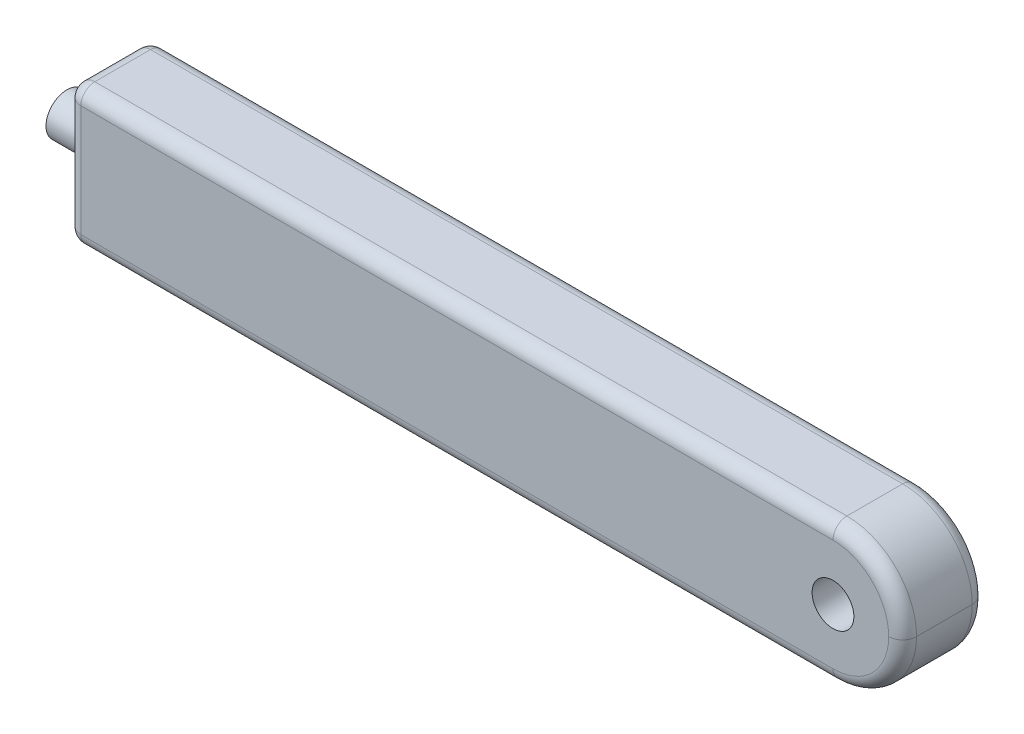
ISO-10303-21;
HEADER;
FILE_DESCRIPTION(('STEP AP214'),'2;1');
FILE_NAME('part.step','',(''),(''),'','','');
FILE_SCHEMA(('AUTOMOTIVE_DESIGN { 1 0 10303 214 1 1 1 1 }'));
ENDSEC;
DATA;
#1=APPLICATION_CONTEXT('core data for automotive mechanical design processes');
#2=APPLICATION_PROTOCOL_DEFINITION('international standard','automotive_design',2000,#1);
#3=PRODUCT_CONTEXT('',#1,'mechanical');
#4=PRODUCT('Part','Part','',(#3));
#5=PRODUCT_RELATED_PRODUCT_CATEGORY('part','',(#4));
#6=PRODUCT_DEFINITION_FORMATION('','',#4);
#7=PRODUCT_DEFINITION_CONTEXT('part definition',#1,'design');
#8=PRODUCT_DEFINITION('design','',#6,#7);
#9=PRODUCT_DEFINITION_SHAPE('','',#8);
#10=(LENGTH_UNIT() NAMED_UNIT(*) SI_UNIT(.MILLI.,.METRE.));
#11=(NAMED_UNIT(*) PLANE_ANGLE_UNIT() SI_UNIT($,.RADIAN.));
#12=(NAMED_UNIT(*) SI_UNIT($,.STERADIAN.) SOLID_ANGLE_UNIT());
#13=UNCERTAINTY_MEASURE_WITH_UNIT(LENGTH_MEASURE(1.E-05),#10,'distance_accuracy_value','');
#14=(GEOMETRIC_REPRESENTATION_CONTEXT(3) GLOBAL_UNCERTAINTY_ASSIGNED_CONTEXT((#13)) GLOBAL_UNIT_ASSIGNED_CONTEXT((#10,
#11,#12)) REPRESENTATION_CONTEXT('',''));
#15=CARTESIAN_POINT('',(0.,0.,0.));
#16=DIRECTION('',(0.,0.,1.));
#17=DIRECTION('',(1.,0.,0.));
#18=AXIS2_PLACEMENT_3D('',#15,#16,#17);
#19=CARTESIAN_POINT('',(0.,0.,30.));
#20=DIRECTION('',(0.,0.,-1.));
#21=DIRECTION('',(-1.,0.,0.));
#22=AXIS2_PLACEMENT_3D('',#19,#20,#21);
#23=PLANE('',#22);
#24=DIRECTION('',(0.,-1.,0.));
#25=VECTOR('',#24,1.);
#26=CARTESIAN_POINT('',(5.,0.,30.));
#27=LINE('',#26,#25);
#28=CARTESIAN_POINT('',(5.,45.,30.));
#29=VERTEX_POINT('',#28);
#30=CARTESIAN_POINT('',(5.,5.,30.));
#31=VERTEX_POINT('',#30);
#32=EDGE_CURVE('E226',#29,#31,#27,.T.);
#33=ORIENTED_EDGE('',*,*,#32,.T.);
#34=DIRECTION('',(1.,0.,0.));
#35=VECTOR('',#34,1.);
#36=CARTESIAN_POINT('',(0.,5.,30.));
#37=LINE('',#36,#35);
#38=CARTESIAN_POINT('',(275.,5.,30.));
#39=VERTEX_POINT('',#38);
#40=EDGE_CURVE('E157',#31,#39,#37,.T.);
#41=ORIENTED_EDGE('',*,*,#40,.T.);
#42=CARTESIAN_POINT('',(275.,25.,30.));
#43=DIRECTION('',(0.,0.,-1.));
#44=DIRECTION('',(-1.,0.,0.));
#45=AXIS2_PLACEMENT_3D('',#42,#43,#44);
#46=CIRCLE('',#45,20.);
#47=CARTESIAN_POINT('',(295.,25.,30.));
#48=VERTEX_POINT('',#47);
#49=EDGE_CURVE('E232',#39,#48,#46,.F.);
#50=ORIENTED_EDGE('',*,*,#49,.T.);
#51=CARTESIAN_POINT('',(275.,25.,30.));
#52=DIRECTION('',(0.,0.,-1.));
#53=DIRECTION('',(-1.,0.,0.));
#54=AXIS2_PLACEMENT_3D('',#51,#52,#53);
#55=CIRCLE('',#54,20.);
#56=CARTESIAN_POINT('',(275.,45.,30.));
#57=VERTEX_POINT('',#56);
#58=EDGE_CURVE('E230',#48,#57,#55,.F.);
#59=ORIENTED_EDGE('',*,*,#58,.T.);
#60=DIRECTION('',(-1.,0.,0.));
#61=VECTOR('',#60,1.);
#62=CARTESIAN_POINT('',(0.,45.,30.));
#63=LINE('',#62,#61);
#64=EDGE_CURVE('E228',#57,#29,#63,.T.);
#65=ORIENTED_EDGE('',*,*,#64,.T.);
#66=EDGE_LOOP('',(#33,#41,#50,#59,#65));
#67=FACE_BOUND('',#66,.T.);
#68=CARTESIAN_POINT('',(275.,25.,30.));
#69=DIRECTION('',(0.,0.,1.));
#70=DIRECTION('',(1.,0.,0.));
#71=AXIS2_PLACEMENT_3D('',#68,#69,#70);
#72=CIRCLE('',#71,7.50000000000001);
#73=CARTESIAN_POINT('',(282.5,25.,30.));
#74=VERTEX_POINT('',#73);
#75=EDGE_CURVE('E149',#74,#74,#72,.T.);
#76=ORIENTED_EDGE('',*,*,#75,.F.);
#77=EDGE_LOOP('',(#76));
#78=FACE_BOUND('',#77,.T.);
#79=ADVANCED_FACE('F38',(#67,#78),#23,.F.);
#80=CARTESIAN_POINT('',(0.,0.,0.));
#81=DIRECTION('',(0.,0.,-1.));
#82=DIRECTION('',(-1.,0.,0.));
#83=AXIS2_PLACEMENT_3D('',#80,#81,#82);
#84=PLANE('',#83);
#85=DIRECTION('',(1.,0.,0.));
#86=VECTOR('',#85,1.);
#87=CARTESIAN_POINT('',(0.,5.,0.));
#88=LINE('',#87,#86);
#89=CARTESIAN_POINT('',(275.,5.,0.));
#90=VERTEX_POINT('',#89);
#91=CARTESIAN_POINT('',(5.,5.,0.));
#92=VERTEX_POINT('',#91);
#93=EDGE_CURVE('E47',#90,#92,#88,.F.);
#94=ORIENTED_EDGE('',*,*,#93,.T.);
#95=DIRECTION('',(0.,-1.,0.));
#96=VECTOR('',#95,1.);
#97=CARTESIAN_POINT('',(5.,50.,0.));
#98=LINE('',#97,#96);
#99=CARTESIAN_POINT('',(5.,45.,0.));
#100=VERTEX_POINT('',#99);
#101=EDGE_CURVE('E11',#92,#100,#98,.F.);
#102=ORIENTED_EDGE('',*,*,#101,.T.);
#103=DIRECTION('',(-1.,0.,0.));
#104=VECTOR('',#103,1.);
#105=CARTESIAN_POINT('',(275.,45.,0.));
#106=LINE('',#105,#104);
#107=CARTESIAN_POINT('',(275.,45.,0.));
#108=VERTEX_POINT('',#107);
#109=EDGE_CURVE('E247',#100,#108,#106,.F.);
#110=ORIENTED_EDGE('',*,*,#109,.T.);
#111=CARTESIAN_POINT('',(275.,25.,0.));
#112=DIRECTION('',(0.,0.,-1.));
#113=DIRECTION('',(-1.,0.,0.));
#114=AXIS2_PLACEMENT_3D('',#111,#112,#113);
#115=CIRCLE('',#114,20.);
#116=CARTESIAN_POINT('',(295.,25.,0.));
#117=VERTEX_POINT('',#116);
#118=EDGE_CURVE('E249',#108,#117,#115,.T.);
#119=ORIENTED_EDGE('',*,*,#118,.T.);
#120=CARTESIAN_POINT('',(275.,25.,0.));
#121=DIRECTION('',(0.,0.,-1.));
#122=DIRECTION('',(-1.,0.,0.));
#123=AXIS2_PLACEMENT_3D('',#120,#121,#122);
#124=CIRCLE('',#123,20.);
#125=EDGE_CURVE('E58',#117,#90,#124,.T.);
#126=ORIENTED_EDGE('',*,*,#125,.T.);
#127=EDGE_LOOP('',(#94,#102,#110,#119,#126));
#128=FACE_BOUND('',#127,.T.);
#129=CARTESIAN_POINT('',(275.,25.,0.));
#130=DIRECTION('',(0.,0.,1.));
#131=DIRECTION('',(1.,0.,0.));
#132=AXIS2_PLACEMENT_3D('',#129,#130,#131);
#133=CIRCLE('',#132,7.50000000000001);
#134=CARTESIAN_POINT('',(282.5,25.,0.));
#135=VERTEX_POINT('',#134);
#136=EDGE_CURVE('E203',#135,#135,#133,.T.);
#137=ORIENTED_EDGE('',*,*,#136,.T.);
#138=EDGE_LOOP('',(#137));
#139=FACE_BOUND('',#138,.T.);
#140=ADVANCED_FACE('F291',(#128,#139),#84,.T.);
#141=CARTESIAN_POINT('',(0.,0.,30.));
#142=DIRECTION('',(1.,0.,0.));
#143=DIRECTION('',(0.,0.,-1.));
#144=AXIS2_PLACEMENT_3D('',#141,#142,#143);
#145=PLANE('',#144);
#146=DIRECTION('',(0.,-1.,0.));
#147=VECTOR('',#146,1.);
#148=CARTESIAN_POINT('',(0.,0.,5.));
#149=LINE('',#148,#147);
#150=CARTESIAN_POINT('',(0.,45.,5.));
#151=VERTEX_POINT('',#150);
#152=CARTESIAN_POINT('',(0.,5.,5.));
#153=VERTEX_POINT('',#152);
#154=EDGE_CURVE('E217',#151,#153,#149,.T.);
#155=ORIENTED_EDGE('',*,*,#154,.T.);
#156=DIRECTION('',(0.,0.,-1.));
#157=VECTOR('',#156,1.);
#158=CARTESIAN_POINT('',(0.,5.,30.));
#159=LINE('',#158,#157);
#160=CARTESIAN_POINT('',(0.,5.,25.));
#161=VERTEX_POINT('',#160);
#162=EDGE_CURVE('E223',#153,#161,#159,.F.);
#163=ORIENTED_EDGE('',*,*,#162,.T.);
#164=DIRECTION('',(0.,-1.,0.));
#165=VECTOR('',#164,1.);
#166=CARTESIAN_POINT('',(0.,0.,25.));
#167=LINE('',#166,#165);
#168=CARTESIAN_POINT('',(0.,45.,25.));
#169=VERTEX_POINT('',#168);
#170=EDGE_CURVE('E221',#161,#169,#167,.F.);
#171=ORIENTED_EDGE('',*,*,#170,.T.);
#172=DIRECTION('',(0.,0.,-1.));
#173=VECTOR('',#172,1.);
#174=CARTESIAN_POINT('',(0.,45.,30.));
#175=LINE('',#174,#173);
#176=EDGE_CURVE('E219',#169,#151,#175,.T.);
#177=ORIENTED_EDGE('',*,*,#176,.T.);
#178=EDGE_LOOP('',(#155,#163,#171,#177));
#179=FACE_BOUND('',#178,.T.);
#180=CARTESIAN_POINT('',(0.,25.,15.));
#181=DIRECTION('',(-1.,0.,0.));
#182=DIRECTION('',(0.,0.,1.));
#183=AXIS2_PLACEMENT_3D('',#180,#181,#182);
#184=CIRCLE('',#183,7.5);
#185=CARTESIAN_POINT('',(0.,25.,22.5));
#186=VERTEX_POINT('',#185);
#187=EDGE_CURVE('E138',#186,#186,#184,.T.);
#188=ORIENTED_EDGE('',*,*,#187,.F.);
#189=EDGE_LOOP('',(#188));
#190=FACE_BOUND('',#189,.T.);
#191=ADVANCED_FACE('F279',(#179,#190),#145,.F.);
#192=CARTESIAN_POINT('',(0.,0.,30.));
#193=DIRECTION('',(0.,1.,0.));
#194=DIRECTION('',(0.,0.,1.));
#195=AXIS2_PLACEMENT_3D('',#192,#193,#194);
#196=PLANE('',#195);
#197=DIRECTION('',(0.,0.,-1.));
#198=VECTOR('',#197,1.);
#199=CARTESIAN_POINT('',(275.,0.,30.));
#200=LINE('',#199,#198);
#201=CARTESIAN_POINT('',(275.,0.,5.));
#202=VERTEX_POINT('',#201);
#203=CARTESIAN_POINT('',(275.,0.,25.));
#204=VERTEX_POINT('',#203);
#205=EDGE_CURVE('E131',#202,#204,#200,.F.);
#206=ORIENTED_EDGE('',*,*,#205,.T.);
#207=DIRECTION('',(1.,0.,0.));
#208=VECTOR('',#207,1.);
#209=CARTESIAN_POINT('',(0.,0.,25.));
#210=LINE('',#209,#208);
#211=CARTESIAN_POINT('',(5.,0.,25.));
#212=VERTEX_POINT('',#211);
#213=EDGE_CURVE('E215',#204,#212,#210,.F.);
#214=ORIENTED_EDGE('',*,*,#213,.T.);
#215=DIRECTION('',(0.,0.,-1.));
#216=VECTOR('',#215,1.);
#217=CARTESIAN_POINT('',(5.,0.,30.));
#218=LINE('',#217,#216);
#219=CARTESIAN_POINT('',(5.,0.,5.));
#220=VERTEX_POINT('',#219);
#221=EDGE_CURVE('E134',#212,#220,#218,.T.);
#222=ORIENTED_EDGE('',*,*,#221,.T.);
#223=DIRECTION('',(1.,0.,0.));
#224=VECTOR('',#223,1.);
#225=CARTESIAN_POINT('',(275.,0.,5.));
#226=LINE('',#225,#224);
#227=EDGE_CURVE('E128',#220,#202,#226,.T.);
#228=ORIENTED_EDGE('',*,*,#227,.T.);
#229=EDGE_LOOP('',(#206,#214,#222,#228));
#230=FACE_BOUND('',#229,.T.);
#231=ADVANCED_FACE('F130',(#230),#196,.F.);
#232=CARTESIAN_POINT('',(0.,50.,30.));
#233=DIRECTION('',(0.,-1.,0.));
#234=DIRECTION('',(0.,0.,-1.));
#235=AXIS2_PLACEMENT_3D('',#232,#233,#234);
#236=PLANE('',#235);
#237=DIRECTION('',(0.,0.,-1.));
#238=VECTOR('',#237,1.);
#239=CARTESIAN_POINT('',(5.,50.,30.));
#240=LINE('',#239,#238);
#241=CARTESIAN_POINT('',(5.,50.,5.));
#242=VERTEX_POINT('',#241);
#243=CARTESIAN_POINT('',(5.,50.,25.));
#244=VERTEX_POINT('',#243);
#245=EDGE_CURVE('E243',#242,#244,#240,.F.);
#246=ORIENTED_EDGE('',*,*,#245,.T.);
#247=DIRECTION('',(-1.,0.,0.));
#248=VECTOR('',#247,1.);
#249=CARTESIAN_POINT('',(0.,50.,25.));
#250=LINE('',#249,#248);
#251=CARTESIAN_POINT('',(275.,50.,25.));
#252=VERTEX_POINT('',#251);
#253=EDGE_CURVE('E245',#244,#252,#250,.F.);
#254=ORIENTED_EDGE('',*,*,#253,.T.);
#255=DIRECTION('',(0.,0.,-1.));
#256=VECTOR('',#255,1.);
#257=CARTESIAN_POINT('',(275.,50.,30.));
#258=LINE('',#257,#256);
#259=CARTESIAN_POINT('',(275.,50.,5.));
#260=VERTEX_POINT('',#259);
#261=EDGE_CURVE('E148',#252,#260,#258,.T.);
#262=ORIENTED_EDGE('',*,*,#261,.T.);
#263=DIRECTION('',(-1.,0.,0.));
#264=VECTOR('',#263,1.);
#265=CARTESIAN_POINT('',(0.,50.,5.));
#266=LINE('',#265,#264);
#267=EDGE_CURVE('E241',#260,#242,#266,.T.);
#268=ORIENTED_EDGE('',*,*,#267,.T.);
#269=EDGE_LOOP('',(#246,#254,#262,#268));
#270=FACE_BOUND('',#269,.T.);
#271=ADVANCED_FACE('F302',(#270),#236,.F.);
#272=CARTESIAN_POINT('',(275.,25.,30.));
#273=DIRECTION('',(0.,0.,-1.));
#274=DIRECTION('',(-1.,0.,0.));
#275=AXIS2_PLACEMENT_3D('',#272,#273,#274);
#276=CYLINDRICAL_SURFACE('',#275,7.50000000000001);
#277=ORIENTED_EDGE('',*,*,#75,.T.);
#278=EDGE_LOOP('',(#277));
#279=FACE_BOUND('',#278,.T.);
#280=ORIENTED_EDGE('',*,*,#136,.F.);
#281=EDGE_LOOP('',(#280));
#282=FACE_BOUND('',#281,.T.);
#283=ADVANCED_FACE('F340',(#279,#282),#276,.F.);
#284=CARTESIAN_POINT('',(275.,25.,30.));
#285=DIRECTION('',(0.,0.,-1.));
#286=DIRECTION('',(-1.,0.,0.));
#287=AXIS2_PLACEMENT_3D('',#284,#285,#286);
#288=CYLINDRICAL_SURFACE('',#287,25.);
#289=ORIENTED_EDGE('',*,*,#261,.F.);
#290=CARTESIAN_POINT('',(275.,25.,25.));
#291=DIRECTION('',(0.,0.,-1.));
#292=DIRECTION('',(-1.,0.,0.));
#293=AXIS2_PLACEMENT_3D('',#290,#291,#292);
#294=CIRCLE('',#293,25.);
#295=CARTESIAN_POINT('',(300.,25.,25.));
#296=VERTEX_POINT('',#295);
#297=EDGE_CURVE('E239',#252,#296,#294,.T.);
#298=ORIENTED_EDGE('',*,*,#297,.T.);
#299=DIRECTION('',(0.,0.,-1.));
#300=VECTOR('',#299,1.);
#301=CARTESIAN_POINT('',(300.,25.,30.));
#302=LINE('',#301,#300);
#303=CARTESIAN_POINT('',(300.,25.,5.));
#304=VERTEX_POINT('',#303);
#305=EDGE_CURVE('E199',#304,#296,#302,.F.);
#306=ORIENTED_EDGE('',*,*,#305,.F.);
#307=CARTESIAN_POINT('',(275.,25.,5.));
#308=DIRECTION('',(0.,0.,-1.));
#309=DIRECTION('',(-1.,0.,0.));
#310=AXIS2_PLACEMENT_3D('',#307,#308,#309);
#311=CIRCLE('',#310,25.);
#312=EDGE_CURVE('E237',#304,#260,#311,.F.);
#313=ORIENTED_EDGE('',*,*,#312,.T.);
#314=EDGE_LOOP('',(#289,#298,#306,#313));
#315=FACE_BOUND('',#314,.T.);
#316=ADVANCED_FACE('F300',(#315),#288,.T.);
#317=CARTESIAN_POINT('',(275.,25.,30.));
#318=DIRECTION('',(0.,0.,-1.));
#319=DIRECTION('',(-1.,0.,0.));
#320=AXIS2_PLACEMENT_3D('',#317,#318,#319);
#321=CYLINDRICAL_SURFACE('',#320,25.);
#322=ORIENTED_EDGE('',*,*,#305,.T.);
#323=CARTESIAN_POINT('',(275.,25.,25.));
#324=DIRECTION('',(0.,0.,-1.));
#325=DIRECTION('',(-1.,0.,0.));
#326=AXIS2_PLACEMENT_3D('',#323,#324,#325);
#327=CIRCLE('',#326,25.);
#328=EDGE_CURVE('E147',#296,#204,#327,.T.);
#329=ORIENTED_EDGE('',*,*,#328,.T.);
#330=ORIENTED_EDGE('',*,*,#205,.F.);
#331=CARTESIAN_POINT('',(275.,25.,5.));
#332=DIRECTION('',(0.,0.,-1.));
#333=DIRECTION('',(-1.,0.,0.));
#334=AXIS2_PLACEMENT_3D('',#331,#332,#333);
#335=CIRCLE('',#334,25.);
#336=EDGE_CURVE('E144',#202,#304,#335,.F.);
#337=ORIENTED_EDGE('',*,*,#336,.T.);
#338=EDGE_LOOP('',(#322,#329,#330,#337));
#339=FACE_BOUND('',#338,.T.);
#340=ADVANCED_FACE('F143',(#339),#321,.T.);
#341=CARTESIAN_POINT('',(-15.,25.,15.));
#342=DIRECTION('',(1.,0.,0.));
#343=DIRECTION('',(0.,0.,-1.));
#344=AXIS2_PLACEMENT_3D('',#341,#342,#343);
#345=CYLINDRICAL_SURFACE('',#344,7.5);
#346=CARTESIAN_POINT('',(-15.,25.,15.));
#347=DIRECTION('',(-1.,0.,0.));
#348=DIRECTION('',(0.,0.,1.));
#349=AXIS2_PLACEMENT_3D('',#346,#347,#348);
#350=CIRCLE('',#349,7.5);
#351=CARTESIAN_POINT('',(-15.,25.,22.5));
#352=VERTEX_POINT('',#351);
#353=EDGE_CURVE('E193',#352,#352,#350,.T.);
#354=ORIENTED_EDGE('',*,*,#353,.F.);
#355=EDGE_LOOP('',(#354));
#356=FACE_BOUND('',#355,.T.);
#357=ORIENTED_EDGE('',*,*,#187,.T.);
#358=EDGE_LOOP('',(#357));
#359=FACE_BOUND('',#358,.T.);
#360=ADVANCED_FACE('F351',(#356,#359),#345,.T.);
#361=CARTESIAN_POINT('',(-15.,25.,15.));
#362=DIRECTION('',(-1.,0.,0.));
#363=DIRECTION('',(0.,0.,1.));
#364=AXIS2_PLACEMENT_3D('',#361,#362,#363);
#365=PLANE('',#364);
#366=ORIENTED_EDGE('',*,*,#353,.T.);
#367=EDGE_LOOP('',(#366));
#368=FACE_BOUND('',#367,.T.);
#369=ADVANCED_FACE('F332',(#368),#365,.T.);
#370=CARTESIAN_POINT('',(0.,45.,25.));
#371=DIRECTION('',(-1.,0.,0.));
#372=DIRECTION('',(0.,0.,1.));
#373=AXIS2_PLACEMENT_3D('',#370,#371,#372);
#374=CYLINDRICAL_SURFACE('',#373,5.);
#375=CARTESIAN_POINT('',(5.,45.,25.));
#376=DIRECTION('',(-1.,0.,0.));
#377=DIRECTION('',(0.,0.,1.));
#378=AXIS2_PLACEMENT_3D('',#375,#376,#377);
#379=CIRCLE('',#378,5.);
#380=EDGE_CURVE('E181',#29,#244,#379,.T.);
#381=ORIENTED_EDGE('',*,*,#380,.F.);
#382=ORIENTED_EDGE('',*,*,#64,.F.);
#383=CARTESIAN_POINT('',(275.,45.,25.));
#384=DIRECTION('',(1.,0.,0.));
#385=DIRECTION('',(0.,0.,-1.));
#386=AXIS2_PLACEMENT_3D('',#383,#384,#385);
#387=CIRCLE('',#386,5.);
#388=EDGE_CURVE('E42',#252,#57,#387,.T.);
#389=ORIENTED_EDGE('',*,*,#388,.F.);
#390=ORIENTED_EDGE('',*,*,#253,.F.);
#391=EDGE_LOOP('',(#381,#382,#389,#390));
#392=FACE_BOUND('',#391,.T.);
#393=ADVANCED_FACE('F40',(#392),#374,.T.);
#394=CARTESIAN_POINT('',(275.,25.,25.));
#395=DIRECTION('',(0.,0.,-1.));
#396=DIRECTION('',(-1.,0.,0.));
#397=AXIS2_PLACEMENT_3D('',#394,#395,#396);
#398=TOROIDAL_SURFACE('',#397,20.,5.);
#399=ORIENTED_EDGE('',*,*,#388,.T.);
#400=ORIENTED_EDGE('',*,*,#58,.F.);
#401=CARTESIAN_POINT('',(295.,25.,25.));
#402=DIRECTION('',(0.,-1.,0.));
#403=DIRECTION('',(0.,0.,-1.));
#404=AXIS2_PLACEMENT_3D('',#401,#402,#403);
#405=CIRCLE('',#404,5.);
#406=EDGE_CURVE('E178',#296,#48,#405,.T.);
#407=ORIENTED_EDGE('',*,*,#406,.F.);
#408=ORIENTED_EDGE('',*,*,#297,.F.);
#409=EDGE_LOOP('',(#399,#400,#407,#408));
#410=FACE_BOUND('',#409,.T.);
#411=ADVANCED_FACE('F324',(#410),#398,.T.);
#412=CARTESIAN_POINT('',(275.,25.,5.));
#413=DIRECTION('',(0.,0.,-1.));
#414=DIRECTION('',(-1.,0.,0.));
#415=AXIS2_PLACEMENT_3D('',#412,#413,#414);
#416=TOROIDAL_SURFACE('',#415,20.,5.);
#417=CARTESIAN_POINT('',(295.,25.,5.));
#418=DIRECTION('',(0.,-1.,0.));
#419=DIRECTION('',(0.,0.,-1.));
#420=AXIS2_PLACEMENT_3D('',#417,#418,#419);
#421=CIRCLE('',#420,5.);
#422=EDGE_CURVE('E156',#117,#304,#421,.T.);
#423=ORIENTED_EDGE('',*,*,#422,.F.);
#424=ORIENTED_EDGE('',*,*,#118,.F.);
#425=CARTESIAN_POINT('',(275.,45.,5.));
#426=DIRECTION('',(-1.,0.,0.));
#427=DIRECTION('',(0.,0.,1.));
#428=AXIS2_PLACEMENT_3D('',#425,#426,#427);
#429=CIRCLE('',#428,5.);
#430=EDGE_CURVE('E186',#260,#108,#429,.T.);
#431=ORIENTED_EDGE('',*,*,#430,.F.);
#432=ORIENTED_EDGE('',*,*,#312,.F.);
#433=EDGE_LOOP('',(#423,#424,#431,#432));
#434=FACE_BOUND('',#433,.T.);
#435=ADVANCED_FACE('F296',(#434),#416,.T.);
#436=CARTESIAN_POINT('',(0.,45.,5.));
#437=DIRECTION('',(1.,0.,0.));
#438=DIRECTION('',(0.,0.,-1.));
#439=AXIS2_PLACEMENT_3D('',#436,#437,#438);
#440=CYLINDRICAL_SURFACE('',#439,5.);
#441=ORIENTED_EDGE('',*,*,#430,.T.);
#442=ORIENTED_EDGE('',*,*,#109,.F.);
#443=CARTESIAN_POINT('',(5.,45.,5.));
#444=DIRECTION('',(-1.,0.,0.));
#445=DIRECTION('',(0.,0.,1.));
#446=AXIS2_PLACEMENT_3D('',#443,#444,#445);
#447=CIRCLE('',#446,5.);
#448=EDGE_CURVE('E174',#242,#100,#447,.T.);
#449=ORIENTED_EDGE('',*,*,#448,.F.);
#450=ORIENTED_EDGE('',*,*,#267,.F.);
#451=EDGE_LOOP('',(#441,#442,#449,#450));
#452=FACE_BOUND('',#451,.T.);
#453=ADVANCED_FACE('F330',(#452),#440,.T.);
#454=CARTESIAN_POINT('',(5.,45.,30.));
#455=DIRECTION('',(0.,0.,-1.));
#456=DIRECTION('',(-1.,0.,0.));
#457=AXIS2_PLACEMENT_3D('',#454,#455,#456);
#458=CYLINDRICAL_SURFACE('',#457,5.);
#459=CARTESIAN_POINT('',(5.,45.,25.));
#460=DIRECTION('',(0.,0.,1.));
#461=DIRECTION('',(1.,0.,0.));
#462=AXIS2_PLACEMENT_3D('',#459,#460,#461);
#463=CIRCLE('',#462,5.);
#464=EDGE_CURVE('E184',#244,#169,#463,.T.);
#465=ORIENTED_EDGE('',*,*,#464,.F.);
#466=ORIENTED_EDGE('',*,*,#245,.F.);
#467=CARTESIAN_POINT('',(5.,45.,5.));
#468=DIRECTION('',(0.,0.,-1.));
#469=DIRECTION('',(-1.,0.,0.));
#470=AXIS2_PLACEMENT_3D('',#467,#468,#469);
#471=CIRCLE('',#470,5.);
#472=EDGE_CURVE('E171',#151,#242,#471,.T.);
#473=ORIENTED_EDGE('',*,*,#472,.F.);
#474=ORIENTED_EDGE('',*,*,#176,.F.);
#475=EDGE_LOOP('',(#465,#466,#473,#474));
#476=FACE_BOUND('',#475,.T.);
#477=ADVANCED_FACE('F310',(#476),#458,.T.);
#478=CARTESIAN_POINT('',(5.,45.,25.));
#479=DIRECTION('',(0.,0.,1.));
#480=DIRECTION('',(1.,0.,0.));
#481=AXIS2_PLACEMENT_3D('',#478,#479,#480);
#482=SPHERICAL_SURFACE('',#481,5.);
#483=ORIENTED_EDGE('',*,*,#380,.T.);
#484=ORIENTED_EDGE('',*,*,#464,.T.);
#485=CARTESIAN_POINT('',(5.,45.,25.));
#486=DIRECTION('',(0.,1.,0.));
#487=DIRECTION('',(0.,0.,1.));
#488=AXIS2_PLACEMENT_3D('',#485,#486,#487);
#489=CIRCLE('',#488,5.);
#490=EDGE_CURVE('E163',#29,#169,#489,.F.);
#491=ORIENTED_EDGE('',*,*,#490,.F.);
#492=EDGE_LOOP('',(#483,#484,#491));
#493=FACE_BOUND('',#492,.T.);
#494=ADVANCED_FACE('F313',(#493),#482,.T.);
#495=CARTESIAN_POINT('',(275.,25.,25.));
#496=DIRECTION('',(0.,0.,-1.));
#497=DIRECTION('',(-1.,0.,0.));
#498=AXIS2_PLACEMENT_3D('',#495,#496,#497);
#499=TOROIDAL_SURFACE('',#498,20.,5.);
#500=ORIENTED_EDGE('',*,*,#406,.T.);
#501=ORIENTED_EDGE('',*,*,#49,.F.);
#502=CARTESIAN_POINT('',(275.,5.,25.));
#503=DIRECTION('',(-1.,0.,0.));
#504=DIRECTION('',(0.,0.,1.));
#505=AXIS2_PLACEMENT_3D('',#502,#503,#504);
#506=CIRCLE('',#505,5.);
#507=EDGE_CURVE('E160',#204,#39,#506,.T.);
#508=ORIENTED_EDGE('',*,*,#507,.F.);
#509=ORIENTED_EDGE('',*,*,#328,.F.);
#510=EDGE_LOOP('',(#500,#501,#508,#509));
#511=FACE_BOUND('',#510,.T.);
#512=ADVANCED_FACE('F322',(#511),#499,.T.);
#513=CARTESIAN_POINT('',(275.,25.,5.));
#514=DIRECTION('',(0.,0.,-1.));
#515=DIRECTION('',(-1.,0.,0.));
#516=AXIS2_PLACEMENT_3D('',#513,#514,#515);
#517=TOROIDAL_SURFACE('',#516,20.,5.);
#518=ORIENTED_EDGE('',*,*,#422,.T.);
#519=ORIENTED_EDGE('',*,*,#336,.F.);
#520=CARTESIAN_POINT('',(275.,5.,5.));
#521=DIRECTION('',(-1.,0.,0.));
#522=DIRECTION('',(0.,0.,1.));
#523=AXIS2_PLACEMENT_3D('',#520,#521,#522);
#524=CIRCLE('',#523,5.);
#525=EDGE_CURVE('E154',#90,#202,#524,.T.);
#526=ORIENTED_EDGE('',*,*,#525,.F.);
#527=ORIENTED_EDGE('',*,*,#125,.F.);
#528=EDGE_LOOP('',(#518,#519,#526,#527));
#529=FACE_BOUND('',#528,.T.);
#530=ADVANCED_FACE('F153',(#529),#517,.T.);
#531=CARTESIAN_POINT('',(5.,45.,5.));
#532=DIRECTION('',(0.,0.,1.));
#533=DIRECTION('',(1.,0.,0.));
#534=AXIS2_PLACEMENT_3D('',#531,#532,#533);
#535=SPHERICAL_SURFACE('',#534,5.);
#536=ORIENTED_EDGE('',*,*,#472,.T.);
#537=ORIENTED_EDGE('',*,*,#448,.T.);
#538=CARTESIAN_POINT('',(5.,45.,5.));
#539=DIRECTION('',(0.,1.,0.));
#540=DIRECTION('',(0.,0.,1.));
#541=AXIS2_PLACEMENT_3D('',#538,#539,#540);
#542=CIRCLE('',#541,5.);
#543=EDGE_CURVE('E161',#151,#100,#542,.F.);
#544=ORIENTED_EDGE('',*,*,#543,.F.);
#545=EDGE_LOOP('',(#536,#537,#544));
#546=FACE_BOUND('',#545,.T.);
#547=ADVANCED_FACE('F368',(#546),#535,.T.);
#548=CARTESIAN_POINT('',(5.,0.,25.));
#549=DIRECTION('',(0.,-1.,0.));
#550=DIRECTION('',(0.,0.,-1.));
#551=AXIS2_PLACEMENT_3D('',#548,#549,#550);
#552=CYLINDRICAL_SURFACE('',#551,5.);
#553=ORIENTED_EDGE('',*,*,#490,.T.);
#554=ORIENTED_EDGE('',*,*,#170,.F.);
#555=CARTESIAN_POINT('',(5.,5.,25.));
#556=DIRECTION('',(0.,-1.,0.));
#557=DIRECTION('',(0.,0.,-1.));
#558=AXIS2_PLACEMENT_3D('',#555,#556,#557);
#559=CIRCLE('',#558,5.);
#560=EDGE_CURVE('E165',#31,#161,#559,.T.);
#561=ORIENTED_EDGE('',*,*,#560,.F.);
#562=ORIENTED_EDGE('',*,*,#32,.F.);
#563=EDGE_LOOP('',(#553,#554,#561,#562));
#564=FACE_BOUND('',#563,.T.);
#565=ADVANCED_FACE('F274',(#564),#552,.T.);
#566=CARTESIAN_POINT('',(0.,5.,25.));
#567=DIRECTION('',(1.,0.,0.));
#568=DIRECTION('',(0.,0.,-1.));
#569=AXIS2_PLACEMENT_3D('',#566,#567,#568);
#570=CYLINDRICAL_SURFACE('',#569,5.);
#571=ORIENTED_EDGE('',*,*,#507,.T.);
#572=ORIENTED_EDGE('',*,*,#40,.F.);
#573=CARTESIAN_POINT('',(5.,5.,25.));
#574=DIRECTION('',(-1.,0.,0.));
#575=DIRECTION('',(0.,0.,1.));
#576=AXIS2_PLACEMENT_3D('',#573,#574,#575);
#577=CIRCLE('',#576,5.);
#578=EDGE_CURVE('E263',#212,#31,#577,.T.);
#579=ORIENTED_EDGE('',*,*,#578,.F.);
#580=ORIENTED_EDGE('',*,*,#213,.F.);
#581=EDGE_LOOP('',(#571,#572,#579,#580));
#582=FACE_BOUND('',#581,.T.);
#583=ADVANCED_FACE('F318',(#582),#570,.T.);
#584=CARTESIAN_POINT('',(0.,5.,5.));
#585=DIRECTION('',(-1.,0.,0.));
#586=DIRECTION('',(0.,0.,1.));
#587=AXIS2_PLACEMENT_3D('',#584,#585,#586);
#588=CYLINDRICAL_SURFACE('',#587,5.);
#589=ORIENTED_EDGE('',*,*,#525,.T.);
#590=ORIENTED_EDGE('',*,*,#227,.F.);
#591=CARTESIAN_POINT('',(5.,5.,5.));
#592=DIRECTION('',(-1.,0.,0.));
#593=DIRECTION('',(0.,0.,1.));
#594=AXIS2_PLACEMENT_3D('',#591,#592,#593);
#595=CIRCLE('',#594,5.);
#596=EDGE_CURVE('E260',#92,#220,#595,.T.);
#597=ORIENTED_EDGE('',*,*,#596,.F.);
#598=ORIENTED_EDGE('',*,*,#93,.F.);
#599=EDGE_LOOP('',(#589,#590,#597,#598));
#600=FACE_BOUND('',#599,.T.);
#601=ADVANCED_FACE('F159',(#600),#588,.T.);
#602=CARTESIAN_POINT('',(5.,0.,5.));
#603=DIRECTION('',(0.,1.,0.));
#604=DIRECTION('',(0.,0.,1.));
#605=AXIS2_PLACEMENT_3D('',#602,#603,#604);
#606=CYLINDRICAL_SURFACE('',#605,5.);
#607=ORIENTED_EDGE('',*,*,#543,.T.);
#608=ORIENTED_EDGE('',*,*,#101,.F.);
#609=CARTESIAN_POINT('',(5.,5.,5.));
#610=DIRECTION('',(0.,-1.,0.));
#611=DIRECTION('',(0.,0.,-1.));
#612=AXIS2_PLACEMENT_3D('',#609,#610,#611);
#613=CIRCLE('',#612,5.);
#614=EDGE_CURVE('E257',#153,#92,#613,.T.);
#615=ORIENTED_EDGE('',*,*,#614,.F.);
#616=ORIENTED_EDGE('',*,*,#154,.F.);
#617=EDGE_LOOP('',(#607,#608,#615,#616));
#618=FACE_BOUND('',#617,.T.);
#619=ADVANCED_FACE('F289',(#618),#606,.T.);
#620=CARTESIAN_POINT('',(5.,5.,25.));
#621=DIRECTION('',(0.,0.,1.));
#622=DIRECTION('',(1.,0.,0.));
#623=AXIS2_PLACEMENT_3D('',#620,#621,#622);
#624=SPHERICAL_SURFACE('',#623,5.);
#625=ORIENTED_EDGE('',*,*,#578,.T.);
#626=ORIENTED_EDGE('',*,*,#560,.T.);
#627=CARTESIAN_POINT('',(5.,5.,25.));
#628=DIRECTION('',(0.,0.,1.));
#629=DIRECTION('',(1.,0.,0.));
#630=AXIS2_PLACEMENT_3D('',#627,#628,#629);
#631=CIRCLE('',#630,5.);
#632=EDGE_CURVE('E255',#212,#161,#631,.F.);
#633=ORIENTED_EDGE('',*,*,#632,.F.);
#634=EDGE_LOOP('',(#625,#626,#633));
#635=FACE_BOUND('',#634,.T.);
#636=ADVANCED_FACE('F270',(#635),#624,.T.);
#637=CARTESIAN_POINT('',(5.,5.,5.));
#638=DIRECTION('',(0.,0.,1.));
#639=DIRECTION('',(1.,0.,0.));
#640=AXIS2_PLACEMENT_3D('',#637,#638,#639);
#641=SPHERICAL_SURFACE('',#640,5.);
#642=ORIENTED_EDGE('',*,*,#614,.T.);
#643=ORIENTED_EDGE('',*,*,#596,.T.);
#644=CARTESIAN_POINT('',(5.,5.,5.));
#645=DIRECTION('',(0.,0.,-1.));
#646=DIRECTION('',(-1.,0.,0.));
#647=AXIS2_PLACEMENT_3D('',#644,#645,#646);
#648=CIRCLE('',#647,5.);
#649=EDGE_CURVE('E253',#153,#220,#648,.F.);
#650=ORIENTED_EDGE('',*,*,#649,.F.);
#651=EDGE_LOOP('',(#642,#643,#650));
#652=FACE_BOUND('',#651,.T.);
#653=ADVANCED_FACE('F287',(#652),#641,.T.);
#654=CARTESIAN_POINT('',(5.,5.,30.));
#655=DIRECTION('',(0.,0.,-1.));
#656=DIRECTION('',(-1.,0.,0.));
#657=AXIS2_PLACEMENT_3D('',#654,#655,#656);
#658=CYLINDRICAL_SURFACE('',#657,5.);
#659=ORIENTED_EDGE('',*,*,#632,.T.);
#660=ORIENTED_EDGE('',*,*,#162,.F.);
#661=ORIENTED_EDGE('',*,*,#649,.T.);
#662=ORIENTED_EDGE('',*,*,#221,.F.);
#663=EDGE_LOOP('',(#659,#660,#661,#662));
#664=FACE_BOUND('',#663,.T.);
#665=ADVANCED_FACE('F285',(#664),#658,.T.);
#666=CLOSED_SHELL('',(#79,#140,#191,#231,#271,#283,#316,#340,#360,#369,#393,#411,#435,#453,#477,
#494,#512,#530,#547,#565,#583,#601,#619,#636,#653,#665));
#667=MANIFOLD_SOLID_BREP('B2',#666);
#668=ADVANCED_BREP_SHAPE_REPRESENTATION('',(#18,#667),#14);
#669=SHAPE_DEFINITION_REPRESENTATION(#9,#668);
ENDSEC;
END-ISO-10303-21;
